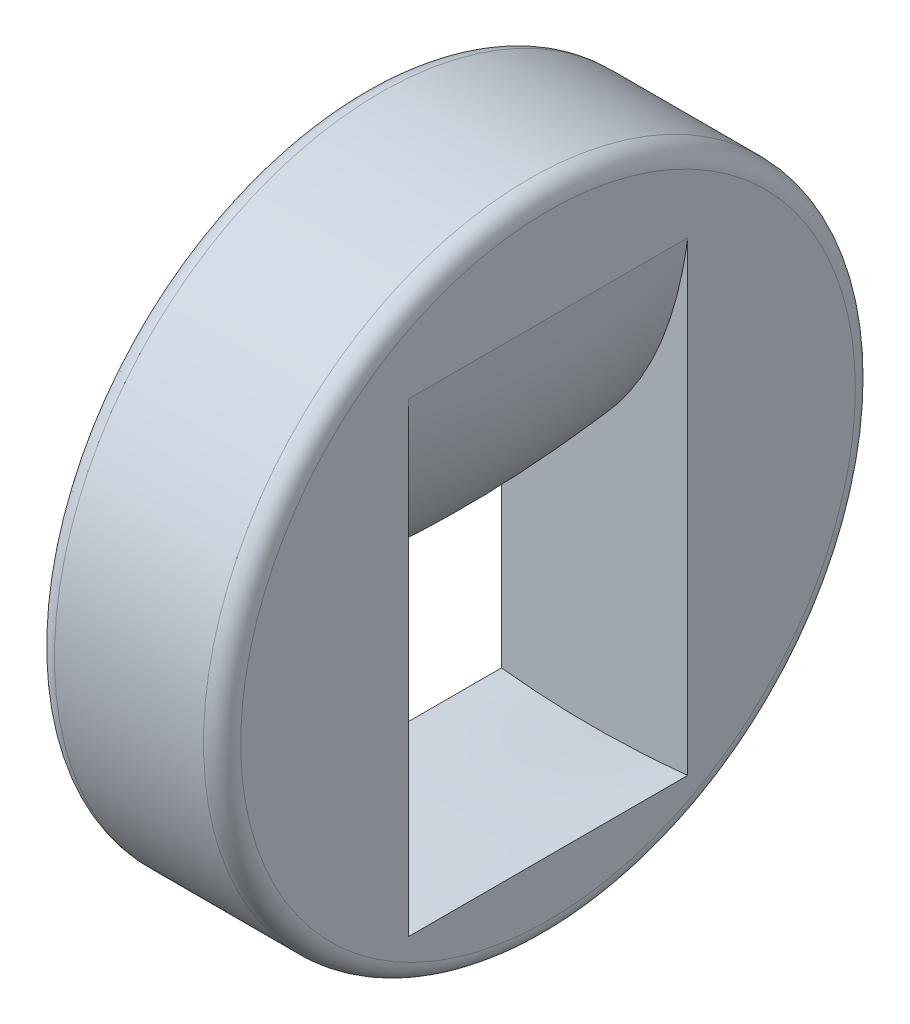
ISO-10303-21;
HEADER;
FILE_DESCRIPTION(('STEP AP214'),'2;1');
FILE_NAME('part.step','',(''),(''),'','','');
FILE_SCHEMA(('AUTOMOTIVE_DESIGN { 1 0 10303 214 1 1 1 1 }'));
ENDSEC;
DATA;
#1=APPLICATION_CONTEXT('core data for automotive mechanical design processes');
#2=APPLICATION_PROTOCOL_DEFINITION('international standard','automotive_design',2000,#1);
#3=PRODUCT_CONTEXT('',#1,'mechanical');
#4=PRODUCT('Part','Part','',(#3));
#5=PRODUCT_RELATED_PRODUCT_CATEGORY('part','',(#4));
#6=PRODUCT_DEFINITION_FORMATION('','',#4);
#7=PRODUCT_DEFINITION_CONTEXT('part definition',#1,'design');
#8=PRODUCT_DEFINITION('design','',#6,#7);
#9=PRODUCT_DEFINITION_SHAPE('','',#8);
#10=(LENGTH_UNIT() NAMED_UNIT(*) SI_UNIT(.MILLI.,.METRE.));
#11=(NAMED_UNIT(*) PLANE_ANGLE_UNIT() SI_UNIT($,.RADIAN.));
#12=(NAMED_UNIT(*) SI_UNIT($,.STERADIAN.) SOLID_ANGLE_UNIT());
#13=UNCERTAINTY_MEASURE_WITH_UNIT(LENGTH_MEASURE(1.E-05),#10,'distance_accuracy_value','');
#14=(GEOMETRIC_REPRESENTATION_CONTEXT(3) GLOBAL_UNCERTAINTY_ASSIGNED_CONTEXT((#13)) GLOBAL_UNIT_ASSIGNED_CONTEXT((#10,
#11,#12)) REPRESENTATION_CONTEXT('',''));
#15=CARTESIAN_POINT('',(0.,0.,0.));
#16=DIRECTION('',(0.,0.,1.));
#17=DIRECTION('',(1.,0.,0.));
#18=AXIS2_PLACEMENT_3D('',#15,#16,#17);
#19=CARTESIAN_POINT('',(-20.,0.,0.));
#20=DIRECTION('',(1.,0.,0.));
#21=DIRECTION('',(0.,0.,-1.));
#22=AXIS2_PLACEMENT_3D('',#19,#20,#21);
#23=PLANE('',#22);
#24=DIRECTION('',(0.,0.,1.));
#25=VECTOR('',#24,1.);
#26=CARTESIAN_POINT('',(-20.,-6.,-0.00311397094890572));
#27=LINE('',#26,#25);
#28=CARTESIAN_POINT('',(-20.,-6.,-15.));
#29=VERTEX_POINT('',#28);
#30=CARTESIAN_POINT('',(-20.,-5.99999999999999,15.));
#31=VERTEX_POINT('',#30);
#32=EDGE_CURVE('E483',#29,#31,#27,.T.);
#33=ORIENTED_EDGE('',*,*,#32,.T.);
#34=DIRECTION('',(0.,-1.,0.));
#35=VECTOR('',#34,1.);
#36=CARTESIAN_POINT('',(-20.,-16.5,15.));
#37=LINE('',#36,#35);
#38=CARTESIAN_POINT('',(-20.,-27.,15.));
#39=VERTEX_POINT('',#38);
#40=EDGE_CURVE('E477',#31,#39,#37,.T.);
#41=ORIENTED_EDGE('',*,*,#40,.T.);
#42=DIRECTION('',(0.,0.,-1.));
#43=VECTOR('',#42,1.);
#44=CARTESIAN_POINT('',(-20.,-27.,0.));
#45=LINE('',#44,#43);
#46=CARTESIAN_POINT('',(-20.,-27.,-15.));
#47=VERTEX_POINT('',#46);
#48=EDGE_CURVE('E464',#39,#47,#45,.T.);
#49=ORIENTED_EDGE('',*,*,#48,.T.);
#50=DIRECTION('',(0.,1.,0.));
#51=VECTOR('',#50,1.);
#52=CARTESIAN_POINT('',(-20.,-16.5,-15.));
#53=LINE('',#52,#51);
#54=EDGE_CURVE('E494',#47,#29,#53,.T.);
#55=ORIENTED_EDGE('',*,*,#54,.T.);
#56=EDGE_LOOP('',(#33,#41,#49,#55));
#57=FACE_BOUND('',#56,.T.);
#58=CARTESIAN_POINT('',(-20.,0.,0.));
#59=DIRECTION('',(1.,0.,0.));
#60=DIRECTION('',(0.,0.,-1.));
#61=AXIS2_PLACEMENT_3D('',#58,#59,#60);
#62=CIRCLE('',#61,33.);
#63=CARTESIAN_POINT('',(-20.,0.,-33.));
#64=VERTEX_POINT('',#63);
#65=EDGE_CURVE('E660',#64,#64,#62,.F.);
#66=ORIENTED_EDGE('',*,*,#65,.T.);
#67=EDGE_LOOP('',(#66));
#68=FACE_BOUND('',#67,.T.);
#69=DIRECTION('',(0.,0.,1.));
#70=VECTOR('',#69,1.);
#71=CARTESIAN_POINT('',(-20.,-1.,0.));
#72=LINE('',#71,#70);
#73=CARTESIAN_POINT('',(-20.,-1.,-5.));
#74=VERTEX_POINT('',#73);
#75=CARTESIAN_POINT('',(-20.,-1.,-2.25));
#76=VERTEX_POINT('',#75);
#77=EDGE_CURVE('E566',#74,#76,#72,.T.);
#78=ORIENTED_EDGE('',*,*,#77,.F.);
#79=DIRECTION('',(0.,-1.,0.));
#80=VECTOR('',#79,1.);
#81=CARTESIAN_POINT('',(-20.,0.,-5.));
#82=LINE('',#81,#80);
#83=CARTESIAN_POINT('',(-20.,1.25,-5.));
#84=VERTEX_POINT('',#83);
#85=EDGE_CURVE('E15',#84,#74,#82,.T.);
#86=ORIENTED_EDGE('',*,*,#85,.F.);
#87=DIRECTION('',(0.,0.,-1.));
#88=VECTOR('',#87,1.);
#89=CARTESIAN_POINT('',(-20.,1.25,0.));
#90=LINE('',#89,#88);
#91=CARTESIAN_POINT('',(-20.,1.25,-1.87082869338697));
#92=VERTEX_POINT('',#91);
#93=EDGE_CURVE('E603',#92,#84,#90,.T.);
#94=ORIENTED_EDGE('',*,*,#93,.F.);
#95=CARTESIAN_POINT('',(-20.,0.,0.));
#96=DIRECTION('',(1.,0.,0.));
#97=DIRECTION('',(0.,0.,-1.));
#98=AXIS2_PLACEMENT_3D('',#95,#96,#97);
#99=CIRCLE('',#98,2.25);
#100=CARTESIAN_POINT('',(-20.,2.01556443707464,-1.));
#101=VERTEX_POINT('',#100);
#102=EDGE_CURVE('E646',#92,#101,#99,.T.);
#103=ORIENTED_EDGE('',*,*,#102,.T.);
#104=DIRECTION('',(0.,-1.,0.));
#105=VECTOR('',#104,1.);
#106=CARTESIAN_POINT('',(-20.,0.,-1.));
#107=LINE('',#106,#105);
#108=CARTESIAN_POINT('',(-20.,4.99999999999999,-0.999999999999997));
#109=VERTEX_POINT('',#108);
#110=EDGE_CURVE('E598',#109,#101,#107,.T.);
#111=ORIENTED_EDGE('',*,*,#110,.F.);
#112=DIRECTION('',(0.,0.,-1.));
#113=VECTOR('',#112,1.);
#114=CARTESIAN_POINT('',(-20.,4.99999999999999,0.));
#115=LINE('',#114,#113);
#116=CARTESIAN_POINT('',(-20.,5.,1.25));
#117=VERTEX_POINT('',#116);
#118=EDGE_CURVE('E299',#117,#109,#115,.T.);
#119=ORIENTED_EDGE('',*,*,#118,.F.);
#120=DIRECTION('',(0.,1.,0.));
#121=VECTOR('',#120,1.);
#122=CARTESIAN_POINT('',(-20.,0.,1.25));
#123=LINE('',#122,#121);
#124=CARTESIAN_POINT('',(-20.,1.87082869338697,1.25));
#125=VERTEX_POINT('',#124);
#126=EDGE_CURVE('E593',#125,#117,#123,.T.);
#127=ORIENTED_EDGE('',*,*,#126,.F.);
#128=CARTESIAN_POINT('',(-20.,0.999999999999987,2.01556443707465));
#129=VERTEX_POINT('',#128);
#130=EDGE_CURVE('E643',#125,#129,#99,.T.);
#131=ORIENTED_EDGE('',*,*,#130,.T.);
#132=DIRECTION('',(0.,0.,-1.));
#133=VECTOR('',#132,1.);
#134=CARTESIAN_POINT('',(-20.,0.999999999999987,0.));
#135=LINE('',#134,#133);
#136=CARTESIAN_POINT('',(-20.,0.999999999999987,4.99999999999999));
#137=VERTEX_POINT('',#136);
#138=EDGE_CURVE('E587',#137,#129,#135,.T.);
#139=ORIENTED_EDGE('',*,*,#138,.F.);
#140=DIRECTION('',(0.,1.,0.));
#141=VECTOR('',#140,1.);
#142=CARTESIAN_POINT('',(-20.,0.,4.99999999999999));
#143=LINE('',#142,#141);
#144=CARTESIAN_POINT('',(-20.,-1.25000000000001,4.99999999999999));
#145=VERTEX_POINT('',#144);
#146=EDGE_CURVE('E669',#145,#137,#143,.T.);
#147=ORIENTED_EDGE('',*,*,#146,.F.);
#148=DIRECTION('',(0.,0.,1.));
#149=VECTOR('',#148,1.);
#150=CARTESIAN_POINT('',(-20.,-1.25,0.));
#151=LINE('',#150,#149);
#152=CARTESIAN_POINT('',(-20.,-1.25000000000001,2.25));
#153=VERTEX_POINT('',#152);
#154=EDGE_CURVE('E582',#153,#145,#151,.T.);
#155=ORIENTED_EDGE('',*,*,#154,.F.);
#156=DIRECTION('',(0.,-1.,0.));
#157=VECTOR('',#156,1.);
#158=CARTESIAN_POINT('',(-20.,0.,2.25));
#159=LINE('',#158,#157);
#160=CARTESIAN_POINT('',(-20.,-2.,2.25));
#161=VERTEX_POINT('',#160);
#162=EDGE_CURVE('E647',#153,#161,#159,.T.);
#163=ORIENTED_EDGE('',*,*,#162,.T.);
#164=DIRECTION('',(0.,0.,-1.));
#165=VECTOR('',#164,1.);
#166=CARTESIAN_POINT('',(-20.,-2.,1.25));
#167=LINE('',#166,#165);
#168=CARTESIAN_POINT('',(-20.,-2.,0.999999999999984));
#169=VERTEX_POINT('',#168);
#170=EDGE_CURVE('E637',#161,#169,#167,.T.);
#171=ORIENTED_EDGE('',*,*,#170,.T.);
#172=DIRECTION('',(0.,1.,0.));
#173=VECTOR('',#172,1.);
#174=CARTESIAN_POINT('',(-20.,0.,0.999999999999984));
#175=LINE('',#174,#173);
#176=CARTESIAN_POINT('',(-20.,-5.,0.999999999999984));
#177=VERTEX_POINT('',#176);
#178=EDGE_CURVE('E577',#177,#169,#175,.T.);
#179=ORIENTED_EDGE('',*,*,#178,.F.);
#180=DIRECTION('',(0.,0.,1.));
#181=VECTOR('',#180,1.);
#182=CARTESIAN_POINT('',(-20.,-5.,0.));
#183=LINE('',#182,#181);
#184=CARTESIAN_POINT('',(-20.,-5.,-1.25000000000002));
#185=VERTEX_POINT('',#184);
#186=EDGE_CURVE('E666',#185,#177,#183,.T.);
#187=ORIENTED_EDGE('',*,*,#186,.F.);
#188=DIRECTION('',(0.,-1.,0.));
#189=VECTOR('',#188,1.);
#190=CARTESIAN_POINT('',(-20.,0.,-1.25000000000002));
#191=LINE('',#190,#189);
#192=CARTESIAN_POINT('',(-20.,-2.,-1.25000000000002));
#193=VERTEX_POINT('',#192);
#194=EDGE_CURVE('E572',#193,#185,#191,.T.);
#195=ORIENTED_EDGE('',*,*,#194,.F.);
#196=CARTESIAN_POINT('',(-20.,-2.,-2.25));
#197=VERTEX_POINT('',#196);
#198=EDGE_CURVE('E620',#193,#197,#167,.T.);
#199=ORIENTED_EDGE('',*,*,#198,.T.);
#200=DIRECTION('',(0.,1.,0.));
#201=VECTOR('',#200,1.);
#202=CARTESIAN_POINT('',(-20.,-1.,-2.25));
#203=LINE('',#202,#201);
#204=EDGE_CURVE('E640',#197,#76,#203,.T.);
#205=ORIENTED_EDGE('',*,*,#204,.T.);
#206=EDGE_LOOP('',(#78,#86,#94,#103,#111,#119,#127,#131,#139,#147,#155,#163,#171,#179,#187,#195,
#199,#205));
#207=FACE_BOUND('',#206,.T.);
#208=ADVANCED_FACE('F291',(#57,#68,#207),#23,.F.);
#209=CARTESIAN_POINT('',(-24.,-2.,1.25));
#210=DIRECTION('',(0.,-1.,0.));
#211=DIRECTION('',(0.,0.,-1.));
#212=AXIS2_PLACEMENT_3D('',#209,#210,#211);
#213=PLANE('',#212);
#214=DIRECTION('',(0.,0.,-1.));
#215=VECTOR('',#214,1.);
#216=CARTESIAN_POINT('',(-24.,-2.,1.25));
#217=LINE('',#216,#215);
#218=CARTESIAN_POINT('',(-24.,-2.,2.25));
#219=VERTEX_POINT('',#218);
#220=CARTESIAN_POINT('',(-24.,-2.,0.999999999999984));
#221=VERTEX_POINT('',#220);
#222=EDGE_CURVE('E626',#219,#221,#217,.T.);
#223=ORIENTED_EDGE('',*,*,#222,.T.);
#224=DIRECTION('',(1.,0.,0.));
#225=VECTOR('',#224,1.);
#226=CARTESIAN_POINT('',(-24.,-2.,0.999999999999984));
#227=LINE('',#226,#225);
#228=EDGE_CURVE('E575',#221,#169,#227,.T.);
#229=ORIENTED_EDGE('',*,*,#228,.T.);
#230=ORIENTED_EDGE('',*,*,#170,.F.);
#231=DIRECTION('',(1.,0.,0.));
#232=VECTOR('',#231,1.);
#233=CARTESIAN_POINT('',(-24.,-2.,2.25));
#234=LINE('',#233,#232);
#235=EDGE_CURVE('E649',#219,#161,#234,.T.);
#236=ORIENTED_EDGE('',*,*,#235,.F.);
#237=EDGE_LOOP('',(#223,#229,#230,#236));
#238=FACE_BOUND('',#237,.T.);
#239=ADVANCED_FACE('F716',(#238),#213,.T.);
#240=ORIENTED_EDGE('',*,*,#198,.F.);
#241=DIRECTION('',(-1.,0.,0.));
#242=VECTOR('',#241,1.);
#243=CARTESIAN_POINT('',(-24.,-2.,-1.25000000000002));
#244=LINE('',#243,#242);
#245=CARTESIAN_POINT('',(-24.,-2.,-1.25000000000002));
#246=VERTEX_POINT('',#245);
#247=EDGE_CURVE('E569',#193,#246,#244,.T.);
#248=ORIENTED_EDGE('',*,*,#247,.T.);
#249=CARTESIAN_POINT('',(-24.,-2.,-2.25));
#250=VERTEX_POINT('',#249);
#251=EDGE_CURVE('E629',#246,#250,#217,.T.);
#252=ORIENTED_EDGE('',*,*,#251,.T.);
#253=DIRECTION('',(1.,0.,0.));
#254=VECTOR('',#253,1.);
#255=CARTESIAN_POINT('',(-24.,-2.,-2.25));
#256=LINE('',#255,#254);
#257=EDGE_CURVE('E636',#250,#197,#256,.T.);
#258=ORIENTED_EDGE('',*,*,#257,.T.);
#259=EDGE_LOOP('',(#240,#248,#252,#258));
#260=FACE_BOUND('',#259,.T.);
#261=ADVANCED_FACE('F733',(#260),#213,.T.);
#262=CARTESIAN_POINT('',(-24.,0.,2.25));
#263=DIRECTION('',(0.,0.,1.));
#264=DIRECTION('',(1.,0.,0.));
#265=AXIS2_PLACEMENT_3D('',#262,#263,#264);
#266=PLANE('',#265);
#267=ORIENTED_EDGE('',*,*,#162,.F.);
#268=DIRECTION('',(-1.,0.,0.));
#269=VECTOR('',#268,1.);
#270=CARTESIAN_POINT('',(-24.,-1.25000000000001,2.25));
#271=LINE('',#270,#269);
#272=CARTESIAN_POINT('',(-24.,-1.25000000000001,2.25));
#273=VERTEX_POINT('',#272);
#274=EDGE_CURVE('E580',#153,#273,#271,.T.);
#275=ORIENTED_EDGE('',*,*,#274,.T.);
#276=DIRECTION('',(0.,-1.,0.));
#277=VECTOR('',#276,1.);
#278=CARTESIAN_POINT('',(-24.,0.,2.25));
#279=LINE('',#278,#277);
#280=EDGE_CURVE('E634',#273,#219,#279,.T.);
#281=ORIENTED_EDGE('',*,*,#280,.T.);
#282=ORIENTED_EDGE('',*,*,#235,.T.);
#283=EDGE_LOOP('',(#267,#275,#281,#282));
#284=FACE_BOUND('',#283,.T.);
#285=ADVANCED_FACE('F709',(#284),#266,.T.);
#286=CARTESIAN_POINT('',(-24.,0.,0.));
#287=DIRECTION('',(1.,0.,0.));
#288=DIRECTION('',(0.,0.,-1.));
#289=AXIS2_PLACEMENT_3D('',#286,#287,#288);
#290=CYLINDRICAL_SURFACE('',#289,2.25);
#291=ORIENTED_EDGE('',*,*,#102,.F.);
#292=DIRECTION('',(1.,0.,0.));
#293=VECTOR('',#292,1.);
#294=CARTESIAN_POINT('',(-24.,1.25,-1.87082869338697));
#295=LINE('',#294,#293);
#296=CARTESIAN_POINT('',(-24.,1.25,-1.87082869338697));
#297=VERTEX_POINT('',#296);
#298=EDGE_CURVE('E601',#92,#297,#295,.F.);
#299=ORIENTED_EDGE('',*,*,#298,.T.);
#300=CARTESIAN_POINT('',(-24.,0.,0.));
#301=DIRECTION('',(1.,0.,0.));
#302=DIRECTION('',(0.,0.,-1.));
#303=AXIS2_PLACEMENT_3D('',#300,#301,#302);
#304=CIRCLE('',#303,2.25);
#305=CARTESIAN_POINT('',(-24.,2.01556443707464,-1.));
#306=VERTEX_POINT('',#305);
#307=EDGE_CURVE('E633',#297,#306,#304,.T.);
#308=ORIENTED_EDGE('',*,*,#307,.T.);
#309=DIRECTION('',(1.,0.,0.));
#310=VECTOR('',#309,1.);
#311=CARTESIAN_POINT('',(-24.,2.01556443707464,-1.));
#312=LINE('',#311,#310);
#313=EDGE_CURVE('E596',#306,#101,#312,.T.);
#314=ORIENTED_EDGE('',*,*,#313,.T.);
#315=EDGE_LOOP('',(#291,#299,#308,#314));
#316=FACE_BOUND('',#315,.T.);
#317=ADVANCED_FACE('F751',(#316),#290,.T.);
#318=ORIENTED_EDGE('',*,*,#130,.F.);
#319=DIRECTION('',(1.,0.,0.));
#320=VECTOR('',#319,1.);
#321=CARTESIAN_POINT('',(-24.,1.87082869338697,1.25));
#322=LINE('',#321,#320);
#323=CARTESIAN_POINT('',(-24.,1.87082869338697,1.25));
#324=VERTEX_POINT('',#323);
#325=EDGE_CURVE('E590',#125,#324,#322,.F.);
#326=ORIENTED_EDGE('',*,*,#325,.T.);
#327=CARTESIAN_POINT('',(-24.,0.999999999999987,2.01556443707464));
#328=VERTEX_POINT('',#327);
#329=EDGE_CURVE('E631',#324,#328,#304,.T.);
#330=ORIENTED_EDGE('',*,*,#329,.T.);
#331=DIRECTION('',(1.,0.,0.));
#332=VECTOR('',#331,1.);
#333=CARTESIAN_POINT('',(-24.,0.999999999999987,2.01556443707464));
#334=LINE('',#333,#332);
#335=EDGE_CURVE('E585',#328,#129,#334,.T.);
#336=ORIENTED_EDGE('',*,*,#335,.T.);
#337=EDGE_LOOP('',(#318,#326,#330,#336));
#338=FACE_BOUND('',#337,.T.);
#339=ADVANCED_FACE('F694',(#338),#290,.T.);
#340=CARTESIAN_POINT('',(-24.,-1.,-2.25));
#341=DIRECTION('',(0.,0.,-1.));
#342=DIRECTION('',(-1.,0.,0.));
#343=AXIS2_PLACEMENT_3D('',#340,#341,#342);
#344=PLANE('',#343);
#345=DIRECTION('',(0.,1.,0.));
#346=VECTOR('',#345,1.);
#347=CARTESIAN_POINT('',(-24.,-1.,-2.25));
#348=LINE('',#347,#346);
#349=CARTESIAN_POINT('',(-24.,-1.,-2.25));
#350=VERTEX_POINT('',#349);
#351=EDGE_CURVE('E628',#250,#350,#348,.T.);
#352=ORIENTED_EDGE('',*,*,#351,.T.);
#353=DIRECTION('',(1.,0.,0.));
#354=VECTOR('',#353,1.);
#355=CARTESIAN_POINT('',(-24.,-1.,-2.25));
#356=LINE('',#355,#354);
#357=EDGE_CURVE('E551',#350,#76,#356,.T.);
#358=ORIENTED_EDGE('',*,*,#357,.T.);
#359=ORIENTED_EDGE('',*,*,#204,.F.);
#360=ORIENTED_EDGE('',*,*,#257,.F.);
#361=EDGE_LOOP('',(#352,#358,#359,#360));
#362=FACE_BOUND('',#361,.T.);
#363=ADVANCED_FACE('F758',(#362),#344,.T.);
#364=CARTESIAN_POINT('',(-20.,0.,0.));
#365=DIRECTION('',(1.,0.,0.));
#366=DIRECTION('',(0.,0.,-1.));
#367=AXIS2_PLACEMENT_3D('',#364,#365,#366);
#368=CYLINDRICAL_SURFACE('',#367,35.);
#369=CARTESIAN_POINT('',(-18.,0.,0.));
#370=DIRECTION('',(1.,0.,0.));
#371=DIRECTION('',(0.,0.,-1.));
#372=AXIS2_PLACEMENT_3D('',#369,#370,#371);
#373=CIRCLE('',#372,35.);
#374=CARTESIAN_POINT('',(-18.,0.,-35.));
#375=VERTEX_POINT('',#374);
#376=EDGE_CURVE('E657',#375,#375,#373,.T.);
#377=ORIENTED_EDGE('',*,*,#376,.T.);
#378=EDGE_LOOP('',(#377));
#379=FACE_BOUND('',#378,.T.);
#380=CARTESIAN_POINT('',(-2.,0.,0.));
#381=DIRECTION('',(1.,0.,0.));
#382=DIRECTION('',(0.,0.,-1.));
#383=AXIS2_PLACEMENT_3D('',#380,#381,#382);
#384=CIRCLE('',#383,35.);
#385=CARTESIAN_POINT('',(-2.,0.,-35.));
#386=VERTEX_POINT('',#385);
#387=EDGE_CURVE('E652',#386,#386,#384,.F.);
#388=ORIENTED_EDGE('',*,*,#387,.T.);
#389=EDGE_LOOP('',(#388));
#390=FACE_BOUND('',#389,.T.);
#391=ADVANCED_FACE('F772',(#379,#390),#368,.T.);
#392=CARTESIAN_POINT('',(0.,0.,0.));
#393=DIRECTION('',(1.,0.,0.));
#394=DIRECTION('',(0.,0.,-1.));
#395=AXIS2_PLACEMENT_3D('',#392,#393,#394);
#396=PLANE('',#395);
#397=DIRECTION('',(0.,-1.,0.));
#398=VECTOR('',#397,1.);
#399=CARTESIAN_POINT('',(0.,-2.,15.));
#400=LINE('',#399,#398);
#401=CARTESIAN_POINT('',(0.,23.,15.));
#402=VERTEX_POINT('',#401);
#403=CARTESIAN_POINT('',(0.,-27.,15.));
#404=VERTEX_POINT('',#403);
#405=EDGE_CURVE('E480',#402,#404,#400,.T.);
#406=ORIENTED_EDGE('',*,*,#405,.F.);
#407=DIRECTION('',(0.,0.,1.));
#408=VECTOR('',#407,1.);
#409=CARTESIAN_POINT('',(0.,23.,-0.00311396848837413));
#410=LINE('',#409,#408);
#411=CARTESIAN_POINT('',(0.,23.,-15.));
#412=VERTEX_POINT('',#411);
#413=EDGE_CURVE('E502',#412,#402,#410,.T.);
#414=ORIENTED_EDGE('',*,*,#413,.F.);
#415=DIRECTION('',(0.,1.,0.));
#416=VECTOR('',#415,1.);
#417=CARTESIAN_POINT('',(0.,-2.,-15.));
#418=LINE('',#417,#416);
#419=CARTESIAN_POINT('',(0.,-27.,-15.));
#420=VERTEX_POINT('',#419);
#421=EDGE_CURVE('E500',#420,#412,#418,.T.);
#422=ORIENTED_EDGE('',*,*,#421,.F.);
#423=DIRECTION('',(0.,0.,-1.));
#424=VECTOR('',#423,1.);
#425=CARTESIAN_POINT('',(0.,-27.,0.));
#426=LINE('',#425,#424);
#427=EDGE_CURVE('E498',#404,#420,#426,.T.);
#428=ORIENTED_EDGE('',*,*,#427,.F.);
#429=EDGE_LOOP('',(#406,#414,#422,#428));
#430=FACE_BOUND('',#429,.T.);
#431=CARTESIAN_POINT('',(0.,0.,0.));
#432=DIRECTION('',(1.,0.,0.));
#433=DIRECTION('',(0.,0.,-1.));
#434=AXIS2_PLACEMENT_3D('',#431,#432,#433);
#435=CIRCLE('',#434,33.);
#436=CARTESIAN_POINT('',(0.,0.,-33.));
#437=VERTEX_POINT('',#436);
#438=EDGE_CURVE('E663',#437,#437,#435,.T.);
#439=ORIENTED_EDGE('',*,*,#438,.T.);
#440=EDGE_LOOP('',(#439));
#441=FACE_BOUND('',#440,.T.);
#442=ADVANCED_FACE('F768',(#430,#441),#396,.T.);
#443=CARTESIAN_POINT('',(-18.,0.,0.));
#444=DIRECTION('',(1.,0.,0.));
#445=DIRECTION('',(0.,0.,-1.));
#446=AXIS2_PLACEMENT_3D('',#443,#444,#445);
#447=TOROIDAL_SURFACE('',#446,33.,2.);
#448=ORIENTED_EDGE('',*,*,#65,.F.);
#449=EDGE_LOOP('',(#448));
#450=FACE_BOUND('',#449,.T.);
#451=ORIENTED_EDGE('',*,*,#376,.F.);
#452=EDGE_LOOP('',(#451));
#453=FACE_BOUND('',#452,.T.);
#454=ADVANCED_FACE('F771',(#450,#453),#447,.T.);
#455=CARTESIAN_POINT('',(-2.,0.,0.));
#456=DIRECTION('',(1.,0.,0.));
#457=DIRECTION('',(0.,0.,-1.));
#458=AXIS2_PLACEMENT_3D('',#455,#456,#457);
#459=TOROIDAL_SURFACE('',#458,33.,2.);
#460=ORIENTED_EDGE('',*,*,#387,.F.);
#461=EDGE_LOOP('',(#460));
#462=FACE_BOUND('',#461,.T.);
#463=ORIENTED_EDGE('',*,*,#438,.F.);
#464=EDGE_LOOP('',(#463));
#465=FACE_BOUND('',#464,.T.);
#466=ADVANCED_FACE('F293',(#462,#465),#459,.T.);
#467=CARTESIAN_POINT('',(-24.,0.,0.));
#468=DIRECTION('',(1.,0.,0.));
#469=DIRECTION('',(0.,0.,-1.));
#470=AXIS2_PLACEMENT_3D('',#467,#468,#469);
#471=PLANE('',#470);
#472=ORIENTED_EDGE('',*,*,#280,.F.);
#473=DIRECTION('',(0.,0.,-1.));
#474=VECTOR('',#473,1.);
#475=CARTESIAN_POINT('',(-24.,-1.25,0.));
#476=LINE('',#475,#474);
#477=CARTESIAN_POINT('',(-24.,-1.25000000000001,4.99999999999999));
#478=VERTEX_POINT('',#477);
#479=EDGE_CURVE('E521',#478,#273,#476,.T.);
#480=ORIENTED_EDGE('',*,*,#479,.F.);
#481=DIRECTION('',(0.,-1.,0.));
#482=VECTOR('',#481,1.);
#483=CARTESIAN_POINT('',(-24.,0.,4.99999999999999));
#484=LINE('',#483,#482);
#485=CARTESIAN_POINT('',(-24.,0.999999999999987,4.99999999999999));
#486=VERTEX_POINT('',#485);
#487=EDGE_CURVE('E524',#486,#478,#484,.T.);
#488=ORIENTED_EDGE('',*,*,#487,.F.);
#489=DIRECTION('',(0.,0.,1.));
#490=VECTOR('',#489,1.);
#491=CARTESIAN_POINT('',(-24.,0.999999999999987,0.));
#492=LINE('',#491,#490);
#493=EDGE_CURVE('E527',#328,#486,#492,.T.);
#494=ORIENTED_EDGE('',*,*,#493,.F.);
#495=ORIENTED_EDGE('',*,*,#329,.F.);
#496=DIRECTION('',(0.,-1.,0.));
#497=VECTOR('',#496,1.);
#498=CARTESIAN_POINT('',(-24.,0.,1.25));
#499=LINE('',#498,#497);
#500=CARTESIAN_POINT('',(-24.,5.,1.25));
#501=VERTEX_POINT('',#500);
#502=EDGE_CURVE('E530',#501,#324,#499,.T.);
#503=ORIENTED_EDGE('',*,*,#502,.F.);
#504=DIRECTION('',(0.,0.,1.));
#505=VECTOR('',#504,1.);
#506=CARTESIAN_POINT('',(-24.,4.99999999999999,0.));
#507=LINE('',#506,#505);
#508=CARTESIAN_POINT('',(-24.,4.99999999999999,-0.999999999999997));
#509=VERTEX_POINT('',#508);
#510=EDGE_CURVE('E533',#509,#501,#507,.T.);
#511=ORIENTED_EDGE('',*,*,#510,.F.);
#512=DIRECTION('',(0.,1.,0.));
#513=VECTOR('',#512,1.);
#514=CARTESIAN_POINT('',(-24.,0.,-1.));
#515=LINE('',#514,#513);
#516=EDGE_CURVE('E536',#306,#509,#515,.T.);
#517=ORIENTED_EDGE('',*,*,#516,.F.);
#518=ORIENTED_EDGE('',*,*,#307,.F.);
#519=DIRECTION('',(0.,0.,1.));
#520=VECTOR('',#519,1.);
#521=CARTESIAN_POINT('',(-24.,1.25,0.));
#522=LINE('',#521,#520);
#523=CARTESIAN_POINT('',(-24.,1.25,-5.));
#524=VERTEX_POINT('',#523);
#525=EDGE_CURVE('E539',#524,#297,#522,.T.);
#526=ORIENTED_EDGE('',*,*,#525,.F.);
#527=DIRECTION('',(0.,1.,0.));
#528=VECTOR('',#527,1.);
#529=CARTESIAN_POINT('',(-24.,0.,-5.));
#530=LINE('',#529,#528);
#531=CARTESIAN_POINT('',(-24.,-1.,-5.));
#532=VERTEX_POINT('',#531);
#533=EDGE_CURVE('E542',#532,#524,#530,.T.);
#534=ORIENTED_EDGE('',*,*,#533,.F.);
#535=DIRECTION('',(0.,0.,-1.));
#536=VECTOR('',#535,1.);
#537=CARTESIAN_POINT('',(-24.,-1.,0.));
#538=LINE('',#537,#536);
#539=EDGE_CURVE('E545',#350,#532,#538,.T.);
#540=ORIENTED_EDGE('',*,*,#539,.F.);
#541=ORIENTED_EDGE('',*,*,#351,.F.);
#542=ORIENTED_EDGE('',*,*,#251,.F.);
#543=DIRECTION('',(0.,1.,0.));
#544=VECTOR('',#543,1.);
#545=CARTESIAN_POINT('',(-24.,0.,-1.25000000000002));
#546=LINE('',#545,#544);
#547=CARTESIAN_POINT('',(-24.,-5.,-1.25000000000002));
#548=VERTEX_POINT('',#547);
#549=EDGE_CURVE('E512',#548,#246,#546,.T.);
#550=ORIENTED_EDGE('',*,*,#549,.F.);
#551=DIRECTION('',(0.,0.,-1.));
#552=VECTOR('',#551,1.);
#553=CARTESIAN_POINT('',(-24.,-5.,0.));
#554=LINE('',#553,#552);
#555=CARTESIAN_POINT('',(-24.,-5.,0.999999999999984));
#556=VERTEX_POINT('',#555);
#557=EDGE_CURVE('E515',#556,#548,#554,.T.);
#558=ORIENTED_EDGE('',*,*,#557,.F.);
#559=DIRECTION('',(0.,-1.,0.));
#560=VECTOR('',#559,1.);
#561=CARTESIAN_POINT('',(-24.,0.,0.999999999999984));
#562=LINE('',#561,#560);
#563=EDGE_CURVE('E518',#221,#556,#562,.T.);
#564=ORIENTED_EDGE('',*,*,#563,.F.);
#565=ORIENTED_EDGE('',*,*,#222,.F.);
#566=EDGE_LOOP('',(#472,#480,#488,#494,#495,#503,#511,#517,#518,#526,#534,#540,#541,#542,#550,
#558,#564,#565));
#567=FACE_BOUND('',#566,.T.);
#568=DIRECTION('',(0.,0.,-1.));
#569=VECTOR('',#568,1.);
#570=CARTESIAN_POINT('',(-24.,-1.,1.25));
#571=LINE('',#570,#569);
#572=CARTESIAN_POINT('',(-24.,-1.,1.25));
#573=VERTEX_POINT('',#572);
#574=CARTESIAN_POINT('',(-24.,-1.,-1.25));
#575=VERTEX_POINT('',#574);
#576=EDGE_CURVE('E606',#573,#575,#571,.T.);
#577=ORIENTED_EDGE('',*,*,#576,.T.);
#578=DIRECTION('',(0.,1.,0.));
#579=VECTOR('',#578,1.);
#580=CARTESIAN_POINT('',(-24.,-1.,-1.25));
#581=LINE('',#580,#579);
#582=CARTESIAN_POINT('',(-24.,0.,-1.25));
#583=VERTEX_POINT('',#582);
#584=EDGE_CURVE('E608',#575,#583,#581,.T.);
#585=ORIENTED_EDGE('',*,*,#584,.T.);
#586=CARTESIAN_POINT('',(-24.,0.,0.));
#587=DIRECTION('',(1.,0.,0.));
#588=DIRECTION('',(0.,0.,-1.));
#589=AXIS2_PLACEMENT_3D('',#586,#587,#588);
#590=CIRCLE('',#589,1.25);
#591=CARTESIAN_POINT('',(-24.,0.,1.25));
#592=VERTEX_POINT('',#591);
#593=EDGE_CURVE('E611',#583,#592,#590,.T.);
#594=ORIENTED_EDGE('',*,*,#593,.T.);
#595=DIRECTION('',(0.,-1.,0.));
#596=VECTOR('',#595,1.);
#597=CARTESIAN_POINT('',(-24.,0.,1.25));
#598=LINE('',#597,#596);
#599=EDGE_CURVE('E614',#592,#573,#598,.T.);
#600=ORIENTED_EDGE('',*,*,#599,.T.);
#601=EDGE_LOOP('',(#577,#585,#594,#600));
#602=FACE_BOUND('',#601,.T.);
#603=ADVANCED_FACE('F686',(#567,#602),#471,.F.);
#604=CARTESIAN_POINT('',(-24.,-1.,1.25));
#605=DIRECTION('',(0.,-1.,0.));
#606=DIRECTION('',(0.,0.,-1.));
#607=AXIS2_PLACEMENT_3D('',#604,#605,#606);
#608=PLANE('',#607);
#609=DIRECTION('',(1.,0.,0.));
#610=VECTOR('',#609,1.);
#611=CARTESIAN_POINT('',(-24.,-1.,1.25));
#612=LINE('',#611,#610);
#613=CARTESIAN_POINT('',(-14.,-1.,1.25));
#614=VERTEX_POINT('',#613);
#615=EDGE_CURVE('E618',#573,#614,#612,.T.);
#616=ORIENTED_EDGE('',*,*,#615,.T.);
#617=DIRECTION('',(0.,0.,-1.));
#618=VECTOR('',#617,1.);
#619=CARTESIAN_POINT('',(-14.,-1.,0.));
#620=LINE('',#619,#618);
#621=CARTESIAN_POINT('',(-14.,-1.,-1.25));
#622=VERTEX_POINT('',#621);
#623=EDGE_CURVE('E506',#614,#622,#620,.T.);
#624=ORIENTED_EDGE('',*,*,#623,.T.);
#625=DIRECTION('',(1.,0.,0.));
#626=VECTOR('',#625,1.);
#627=CARTESIAN_POINT('',(-24.,-1.,-1.25));
#628=LINE('',#627,#626);
#629=EDGE_CURVE('E617',#575,#622,#628,.T.);
#630=ORIENTED_EDGE('',*,*,#629,.F.);
#631=ORIENTED_EDGE('',*,*,#576,.F.);
#632=EDGE_LOOP('',(#616,#624,#630,#631));
#633=FACE_BOUND('',#632,.T.);
#634=ADVANCED_FACE('F793',(#633),#608,.F.);
#635=CARTESIAN_POINT('',(-24.,0.,1.25));
#636=DIRECTION('',(0.,0.,1.));
#637=DIRECTION('',(1.,0.,0.));
#638=AXIS2_PLACEMENT_3D('',#635,#636,#637);
#639=PLANE('',#638);
#640=DIRECTION('',(1.,0.,0.));
#641=VECTOR('',#640,1.);
#642=CARTESIAN_POINT('',(-24.,0.,1.25));
#643=LINE('',#642,#641);
#644=CARTESIAN_POINT('',(-14.,0.,1.25));
#645=VERTEX_POINT('',#644);
#646=EDGE_CURVE('E621',#592,#645,#643,.T.);
#647=ORIENTED_EDGE('',*,*,#646,.T.);
#648=DIRECTION('',(0.,-1.,0.));
#649=VECTOR('',#648,1.);
#650=CARTESIAN_POINT('',(-14.,0.,1.25));
#651=LINE('',#650,#649);
#652=EDGE_CURVE('E509',#645,#614,#651,.T.);
#653=ORIENTED_EDGE('',*,*,#652,.T.);
#654=ORIENTED_EDGE('',*,*,#615,.F.);
#655=ORIENTED_EDGE('',*,*,#599,.F.);
#656=EDGE_LOOP('',(#647,#653,#654,#655));
#657=FACE_BOUND('',#656,.T.);
#658=ADVANCED_FACE('F798',(#657),#639,.F.);
#659=CARTESIAN_POINT('',(-24.,0.,0.));
#660=DIRECTION('',(1.,0.,0.));
#661=DIRECTION('',(0.,0.,-1.));
#662=AXIS2_PLACEMENT_3D('',#659,#660,#661);
#663=CYLINDRICAL_SURFACE('',#662,1.25);
#664=DIRECTION('',(1.,0.,0.));
#665=VECTOR('',#664,1.);
#666=CARTESIAN_POINT('',(-24.,0.,-1.25));
#667=LINE('',#666,#665);
#668=CARTESIAN_POINT('',(-14.,0.,-1.25));
#669=VERTEX_POINT('',#668);
#670=EDGE_CURVE('E623',#583,#669,#667,.T.);
#671=ORIENTED_EDGE('',*,*,#670,.T.);
#672=CARTESIAN_POINT('',(-14.,0.,0.));
#673=DIRECTION('',(-1.,0.,0.));
#674=DIRECTION('',(0.,0.,1.));
#675=AXIS2_PLACEMENT_3D('',#672,#673,#674);
#676=CIRCLE('',#675,1.25);
#677=EDGE_CURVE('E484',#669,#645,#676,.F.);
#678=ORIENTED_EDGE('',*,*,#677,.T.);
#679=ORIENTED_EDGE('',*,*,#646,.F.);
#680=ORIENTED_EDGE('',*,*,#593,.F.);
#681=EDGE_LOOP('',(#671,#678,#679,#680));
#682=FACE_BOUND('',#681,.T.);
#683=ADVANCED_FACE('F805',(#682),#663,.F.);
#684=CARTESIAN_POINT('',(-24.,-1.,-1.25));
#685=DIRECTION('',(0.,0.,-1.));
#686=DIRECTION('',(-1.,0.,0.));
#687=AXIS2_PLACEMENT_3D('',#684,#685,#686);
#688=PLANE('',#687);
#689=ORIENTED_EDGE('',*,*,#629,.T.);
#690=DIRECTION('',(0.,1.,0.));
#691=VECTOR('',#690,1.);
#692=CARTESIAN_POINT('',(-14.,0.,-1.25));
#693=LINE('',#692,#691);
#694=EDGE_CURVE('E487',#622,#669,#693,.T.);
#695=ORIENTED_EDGE('',*,*,#694,.T.);
#696=ORIENTED_EDGE('',*,*,#670,.F.);
#697=ORIENTED_EDGE('',*,*,#584,.F.);
#698=EDGE_LOOP('',(#689,#695,#696,#697));
#699=FACE_BOUND('',#698,.T.);
#700=ADVANCED_FACE('F802',(#699),#688,.F.);
#701=CARTESIAN_POINT('',(-14.,-1.,0.));
#702=DIRECTION('',(0.,1.,0.));
#703=DIRECTION('',(0.,0.,1.));
#704=AXIS2_PLACEMENT_3D('',#701,#702,#703);
#705=PLANE('',#704);
#706=DIRECTION('',(-1.,0.,0.));
#707=VECTOR('',#706,1.);
#708=CARTESIAN_POINT('',(-14.,-1.,-5.));
#709=LINE('',#708,#707);
#710=EDGE_CURVE('E549',#74,#532,#709,.T.);
#711=ORIENTED_EDGE('',*,*,#710,.F.);
#712=ORIENTED_EDGE('',*,*,#77,.T.);
#713=ORIENTED_EDGE('',*,*,#357,.F.);
#714=ORIENTED_EDGE('',*,*,#539,.T.);
#715=EDGE_LOOP('',(#711,#712,#713,#714));
#716=FACE_BOUND('',#715,.T.);
#717=ADVANCED_FACE('F739',(#716),#705,.F.);
#718=CARTESIAN_POINT('',(-14.,1.25,0.));
#719=DIRECTION('',(0.,-1.,0.));
#720=DIRECTION('',(0.,0.,-1.));
#721=AXIS2_PLACEMENT_3D('',#718,#719,#720);
#722=PLANE('',#721);
#723=ORIENTED_EDGE('',*,*,#298,.F.);
#724=ORIENTED_EDGE('',*,*,#93,.T.);
#725=DIRECTION('',(-1.,0.,0.));
#726=VECTOR('',#725,1.);
#727=CARTESIAN_POINT('',(-14.,1.25,-5.));
#728=LINE('',#727,#726);
#729=EDGE_CURVE('E552',#84,#524,#728,.T.);
#730=ORIENTED_EDGE('',*,*,#729,.T.);
#731=ORIENTED_EDGE('',*,*,#525,.T.);
#732=EDGE_LOOP('',(#723,#724,#730,#731));
#733=FACE_BOUND('',#732,.T.);
#734=ADVANCED_FACE('F748',(#733),#722,.F.);
#735=CARTESIAN_POINT('',(-14.,0.,-5.));
#736=DIRECTION('',(0.,0.,1.));
#737=DIRECTION('',(1.,0.,0.));
#738=AXIS2_PLACEMENT_3D('',#735,#736,#737);
#739=PLANE('',#738);
#740=ORIENTED_EDGE('',*,*,#729,.F.);
#741=ORIENTED_EDGE('',*,*,#85,.T.);
#742=ORIENTED_EDGE('',*,*,#710,.T.);
#743=ORIENTED_EDGE('',*,*,#533,.T.);
#744=EDGE_LOOP('',(#740,#741,#742,#743));
#745=FACE_BOUND('',#744,.T.);
#746=ADVANCED_FACE('F743',(#745),#739,.F.);
#747=CARTESIAN_POINT('',(-14.,0.999999999999987,0.));
#748=DIRECTION('',(0.,-1.,0.));
#749=DIRECTION('',(0.,0.,-1.));
#750=AXIS2_PLACEMENT_3D('',#747,#748,#749);
#751=PLANE('',#750);
#752=DIRECTION('',(-1.,0.,0.));
#753=VECTOR('',#752,1.);
#754=CARTESIAN_POINT('',(-14.,0.999999999999987,4.99999999999999));
#755=LINE('',#754,#753);
#756=EDGE_CURVE('E558',#137,#486,#755,.T.);
#757=ORIENTED_EDGE('',*,*,#756,.F.);
#758=ORIENTED_EDGE('',*,*,#138,.T.);
#759=ORIENTED_EDGE('',*,*,#335,.F.);
#760=ORIENTED_EDGE('',*,*,#493,.T.);
#761=EDGE_LOOP('',(#757,#758,#759,#760));
#762=FACE_BOUND('',#761,.T.);
#763=ADVANCED_FACE('F698',(#762),#751,.F.);
#764=CARTESIAN_POINT('',(-14.,-1.25,0.));
#765=DIRECTION('',(0.,1.,0.));
#766=DIRECTION('',(0.,0.,1.));
#767=AXIS2_PLACEMENT_3D('',#764,#765,#766);
#768=PLANE('',#767);
#769=ORIENTED_EDGE('',*,*,#274,.F.);
#770=ORIENTED_EDGE('',*,*,#154,.T.);
#771=DIRECTION('',(-1.,0.,0.));
#772=VECTOR('',#771,1.);
#773=CARTESIAN_POINT('',(-14.,-1.25000000000001,4.99999999999999));
#774=LINE('',#773,#772);
#775=EDGE_CURVE('E560',#145,#478,#774,.T.);
#776=ORIENTED_EDGE('',*,*,#775,.T.);
#777=ORIENTED_EDGE('',*,*,#479,.T.);
#778=EDGE_LOOP('',(#769,#770,#776,#777));
#779=FACE_BOUND('',#778,.T.);
#780=ADVANCED_FACE('F707',(#779),#768,.F.);
#781=CARTESIAN_POINT('',(-14.,0.,4.99999999999999));
#782=DIRECTION('',(0.,0.,-1.));
#783=DIRECTION('',(-1.,0.,0.));
#784=AXIS2_PLACEMENT_3D('',#781,#782,#783);
#785=PLANE('',#784);
#786=ORIENTED_EDGE('',*,*,#775,.F.);
#787=ORIENTED_EDGE('',*,*,#146,.T.);
#788=ORIENTED_EDGE('',*,*,#756,.T.);
#789=ORIENTED_EDGE('',*,*,#487,.T.);
#790=EDGE_LOOP('',(#786,#787,#788,#789));
#791=FACE_BOUND('',#790,.T.);
#792=ADVANCED_FACE('F703',(#791),#785,.F.);
#793=CARTESIAN_POINT('',(-14.,0.,1.25));
#794=DIRECTION('',(0.,0.,-1.));
#795=DIRECTION('',(-1.,0.,0.));
#796=AXIS2_PLACEMENT_3D('',#793,#794,#795);
#797=PLANE('',#796);
#798=ORIENTED_EDGE('',*,*,#325,.F.);
#799=ORIENTED_EDGE('',*,*,#126,.T.);
#800=DIRECTION('',(-1.,0.,0.));
#801=VECTOR('',#800,1.);
#802=CARTESIAN_POINT('',(-14.,5.,1.25));
#803=LINE('',#802,#801);
#804=EDGE_CURVE('E556',#117,#501,#803,.T.);
#805=ORIENTED_EDGE('',*,*,#804,.T.);
#806=ORIENTED_EDGE('',*,*,#502,.T.);
#807=EDGE_LOOP('',(#798,#799,#805,#806));
#808=FACE_BOUND('',#807,.T.);
#809=ADVANCED_FACE('F691',(#808),#797,.F.);
#810=CARTESIAN_POINT('',(-14.,0.,-1.));
#811=DIRECTION('',(0.,0.,1.));
#812=DIRECTION('',(0.,-1.,0.));
#813=AXIS2_PLACEMENT_3D('',#810,#811,#812);
#814=PLANE('',#813);
#815=DIRECTION('',(-1.,0.,0.));
#816=VECTOR('',#815,1.);
#817=CARTESIAN_POINT('',(-14.,4.99999999999999,-0.999999999999997));
#818=LINE('',#817,#816);
#819=EDGE_CURVE('E554',#109,#509,#818,.T.);
#820=ORIENTED_EDGE('',*,*,#819,.F.);
#821=ORIENTED_EDGE('',*,*,#110,.T.);
#822=ORIENTED_EDGE('',*,*,#313,.F.);
#823=ORIENTED_EDGE('',*,*,#516,.T.);
#824=EDGE_LOOP('',(#820,#821,#822,#823));
#825=FACE_BOUND('',#824,.T.);
#826=ADVANCED_FACE('F678',(#825),#814,.F.);
#827=CARTESIAN_POINT('',(-14.,4.99999999999999,0.));
#828=DIRECTION('',(0.,-1.,0.));
#829=DIRECTION('',(0.,0.,-1.));
#830=AXIS2_PLACEMENT_3D('',#827,#828,#829);
#831=PLANE('',#830);
#832=ORIENTED_EDGE('',*,*,#804,.F.);
#833=ORIENTED_EDGE('',*,*,#118,.T.);
#834=ORIENTED_EDGE('',*,*,#819,.T.);
#835=ORIENTED_EDGE('',*,*,#510,.T.);
#836=EDGE_LOOP('',(#832,#833,#834,#835));
#837=FACE_BOUND('',#836,.T.);
#838=ADVANCED_FACE('F675',(#837),#831,.F.);
#839=CARTESIAN_POINT('',(-14.,-5.,0.));
#840=DIRECTION('',(0.,1.,0.));
#841=DIRECTION('',(0.,0.,1.));
#842=AXIS2_PLACEMENT_3D('',#839,#840,#841);
#843=PLANE('',#842);
#844=DIRECTION('',(-1.,0.,0.));
#845=VECTOR('',#844,1.);
#846=CARTESIAN_POINT('',(-14.,-5.,-1.25000000000002));
#847=LINE('',#846,#845);
#848=EDGE_CURVE('E548',#185,#548,#847,.T.);
#849=ORIENTED_EDGE('',*,*,#848,.F.);
#850=ORIENTED_EDGE('',*,*,#186,.T.);
#851=DIRECTION('',(-1.,0.,0.));
#852=VECTOR('',#851,1.);
#853=CARTESIAN_POINT('',(-14.,-5.,0.999999999999984));
#854=LINE('',#853,#852);
#855=EDGE_CURVE('E562',#177,#556,#854,.T.);
#856=ORIENTED_EDGE('',*,*,#855,.T.);
#857=ORIENTED_EDGE('',*,*,#557,.T.);
#858=EDGE_LOOP('',(#849,#850,#856,#857));
#859=FACE_BOUND('',#858,.T.);
#860=ADVANCED_FACE('F723',(#859),#843,.F.);
#861=CARTESIAN_POINT('',(-14.,0.,0.999999999999984));
#862=DIRECTION('',(0.,0.,-1.));
#863=DIRECTION('',(-1.,0.,0.));
#864=AXIS2_PLACEMENT_3D('',#861,#862,#863);
#865=PLANE('',#864);
#866=ORIENTED_EDGE('',*,*,#855,.F.);
#867=ORIENTED_EDGE('',*,*,#178,.T.);
#868=ORIENTED_EDGE('',*,*,#228,.F.);
#869=ORIENTED_EDGE('',*,*,#563,.T.);
#870=EDGE_LOOP('',(#866,#867,#868,#869));
#871=FACE_BOUND('',#870,.T.);
#872=ADVANCED_FACE('F720',(#871),#865,.F.);
#873=CARTESIAN_POINT('',(-14.,0.,-1.25000000000002));
#874=DIRECTION('',(0.,0.,1.));
#875=DIRECTION('',(1.,0.,0.));
#876=AXIS2_PLACEMENT_3D('',#873,#874,#875);
#877=PLANE('',#876);
#878=ORIENTED_EDGE('',*,*,#247,.F.);
#879=ORIENTED_EDGE('',*,*,#194,.T.);
#880=ORIENTED_EDGE('',*,*,#848,.T.);
#881=ORIENTED_EDGE('',*,*,#549,.T.);
#882=EDGE_LOOP('',(#878,#879,#880,#881));
#883=FACE_BOUND('',#882,.T.);
#884=ADVANCED_FACE('F727',(#883),#877,.F.);
#885=CARTESIAN_POINT('',(-14.,0.,0.));
#886=DIRECTION('',(-1.,0.,0.));
#887=DIRECTION('',(0.,0.,1.));
#888=AXIS2_PLACEMENT_3D('',#885,#886,#887);
#889=PLANE('',#888);
#890=ORIENTED_EDGE('',*,*,#677,.F.);
#891=ORIENTED_EDGE('',*,*,#694,.F.);
#892=ORIENTED_EDGE('',*,*,#623,.F.);
#893=ORIENTED_EDGE('',*,*,#652,.F.);
#894=EDGE_LOOP('',(#890,#891,#892,#893));
#895=FACE_BOUND('',#894,.T.);
#896=ADVANCED_FACE('F815',(#895),#889,.T.);
#897=CARTESIAN_POINT('',(-20.,-5.99999999999999,15.));
#898=DIRECTION('',(0.,0.,1.));
#899=DIRECTION('',(0.,-1.,0.));
#900=AXIS2_PLACEMENT_3D('',#897,#898,#899);
#901=PLANE('',#900);
#902=ORIENTED_EDGE('',*,*,#40,.F.);
#903=CARTESIAN_POINT('',(-20.,-5.99999999999999,15.));
#904=CARTESIAN_POINT('',(-8.53517852686941,-0.402620434811741,15.));
#905=CARTESIAN_POINT('',(-1.86851186020274,8.98172443159465,15.));
#906=CARTESIAN_POINT('',(0.,23.,15.));
#907=B_SPLINE_CURVE_WITH_KNOTS('',3,(#903,#904,#905,#906),.UNSPECIFIED.,.F.,.F.,(4,4),(0.,1.),.UNSPECIFIED.);
#908=EDGE_CURVE('E306',#31,#402,#907,.T.);
#909=ORIENTED_EDGE('',*,*,#908,.T.);
#910=ORIENTED_EDGE('',*,*,#405,.T.);
#911=CARTESIAN_POINT('',(-20.,-27.,15.));
#912=CARTESIAN_POINT('',(-12.5122358760457,-27.8617914595985,15.));
#913=CARTESIAN_POINT('',(-5.84556920937902,-27.5792575634573,15.));
#914=CARTESIAN_POINT('',(0.,-27.,15.));
#915=B_SPLINE_CURVE_WITH_KNOTS('',3,(#911,#912,#913,#914),.UNSPECIFIED.,.F.,.F.,(4,4),(0.,1.),.UNSPECIFIED.);
#916=EDGE_CURVE('E467',#39,#404,#915,.T.);
#917=ORIENTED_EDGE('',*,*,#916,.F.);
#918=EDGE_LOOP('',(#902,#909,#910,#917));
#919=FACE_BOUND('',#918,.T.);
#920=ADVANCED_FACE('F476',(#919),#901,.F.);
#921=CARTESIAN_POINT('',(-20.,-27.,15.));
#922=CARTESIAN_POINT('',(-12.5122358760457,-27.8617914595985,15.));
#923=CARTESIAN_POINT('',(-5.84556920937902,-27.5792575634573,15.));
#924=CARTESIAN_POINT('',(0.,-27.,15.));
#925=CARTESIAN_POINT('',(-20.,-27.,13.75));
#926=CARTESIAN_POINT('',(-12.6359939333539,-27.7318998908229,13.75));
#927=CARTESIAN_POINT('',(-5.96932726668723,-27.491950277217,13.75));
#928=CARTESIAN_POINT('',(0.,-27.,13.75));
#929=CARTESIAN_POINT('',(-20.,-27.,11.25));
#930=CARTESIAN_POINT('',(-12.8623891728231,-27.4942843895976,11.25));
#931=CARTESIAN_POINT('',(-6.19572250615639,-27.3322357955446,11.25));
#932=CARTESIAN_POINT('',(0.,-27.,11.25));
#933=CARTESIAN_POINT('',(-20.,-27.,7.50000000000001));
#934=CARTESIAN_POINT('',(-13.1238914478154,-27.219821930539,7.50000000000001));
#935=CARTESIAN_POINT('',(-6.45722478114868,-27.1477544415882,7.50000000000001));
#936=CARTESIAN_POINT('',(0.,-27.,7.50000000000001));
#937=CARTESIAN_POINT('',(-20.,-27.,3.75));
#938=CARTESIAN_POINT('',(-13.2925751798265,-27.042778148062,3.75));
#939=CARTESIAN_POINT('',(-6.62590851315981,-27.028753552312,3.75));
#940=CARTESIAN_POINT('',(0.,-27.,3.75));
#941=CARTESIAN_POINT('',(-20.,-27.,0.));
#942=CARTESIAN_POINT('',(-13.3537124100868,-26.978610925969,0.));
#943=CARTESIAN_POINT('',(-6.6870457434201,-26.985623223844,0.));
#944=CARTESIAN_POINT('',(0.,-27.,0.));
#945=CARTESIAN_POINT('',(-20.,-27.,-3.75));
#946=CARTESIAN_POINT('',(-13.2925751798265,-27.042778148062,-3.75));
#947=CARTESIAN_POINT('',(-6.62590851315981,-27.028753552312,-3.75));
#948=CARTESIAN_POINT('',(0.,-27.,-3.75));
#949=CARTESIAN_POINT('',(-20.,-27.,-7.5));
#950=CARTESIAN_POINT('',(-13.1238914478153,-27.219821930539,-7.50000000000001));
#951=CARTESIAN_POINT('',(-6.45722478114868,-27.1477544415882,-7.5));
#952=CARTESIAN_POINT('',(0.,-27.,-7.50000000000001));
#953=CARTESIAN_POINT('',(-20.,-27.,-11.25));
#954=CARTESIAN_POINT('',(-12.8623891728231,-27.4942843895975,-11.25));
#955=CARTESIAN_POINT('',(-6.19572250615639,-27.3322357955446,-11.25));
#956=CARTESIAN_POINT('',(0.,-27.,-11.25));
#957=CARTESIAN_POINT('',(-20.,-27.,-13.75));
#958=CARTESIAN_POINT('',(-12.6359939333539,-27.7318998908229,-13.75));
#959=CARTESIAN_POINT('',(-5.96932726668723,-27.491950277217,-13.75));
#960=CARTESIAN_POINT('',(0.,-27.,-13.75));
#961=CARTESIAN_POINT('',(-20.,-27.,-15.));
#962=CARTESIAN_POINT('',(-12.5122358760457,-27.8617914595985,-15.));
#963=CARTESIAN_POINT('',(-5.84556920937902,-27.5792575634573,-15.));
#964=CARTESIAN_POINT('',(0.,-27.,-15.));
#965=B_SPLINE_SURFACE_WITH_KNOTS('',3,3,((#921,#922,#923,#924),(#925,#926,#927,#928),(#929,#930,
#931,#932),(#933,#934,#935,#936),(#937,#938,#939,#940),(#941,#942,#943,#944),(#945,#946,#947,
#948),(#949,#950,#951,#952),(#953,#954,#955,#956),(#957,#958,#959,#960),(#961,#962,#963,#964)),
.UNSPECIFIED.,.F.,.F.,.F.,(4,1,1,1,1,1,1,1,4),(4,4),(0.,0.125,0.25,0.375,0.5,0.625,0.75,0.875,
1.),(0.,1.),.UNSPECIFIED.);
#966=CARTESIAN_POINT('',(-20.,-27.,-15.));
#967=CARTESIAN_POINT('',(-12.5122358760457,-27.8617914595985,-15.));
#968=CARTESIAN_POINT('',(-5.84556920937902,-27.5792575634573,-15.));
#969=CARTESIAN_POINT('',(0.,-27.,-15.));
#970=B_SPLINE_CURVE_WITH_KNOTS('',3,(#966,#967,#968,#969),.UNSPECIFIED.,.F.,.F.,(4,4),(0.,1.),.UNSPECIFIED.);
#971=EDGE_CURVE('E470',#47,#420,#970,.T.);
#972=ORIENTED_EDGE('',*,*,#48,.F.);
#973=ORIENTED_EDGE('',*,*,#916,.T.);
#974=ORIENTED_EDGE('',*,*,#427,.T.);
#975=ORIENTED_EDGE('',*,*,#971,.F.);
#976=EDGE_LOOP('',(#972,#973,#974,#975));
#977=FACE_BOUND('',#976,.T.);
#978=ADVANCED_FACE('F466',(#977),#965,.F.);
#979=CARTESIAN_POINT('',(-20.,-27.,-15.));
#980=DIRECTION('',(0.,0.,-1.));
#981=DIRECTION('',(0.,1.,0.));
#982=AXIS2_PLACEMENT_3D('',#979,#980,#981);
#983=PLANE('',#982);
#984=ORIENTED_EDGE('',*,*,#54,.F.);
#985=ORIENTED_EDGE('',*,*,#971,.T.);
#986=ORIENTED_EDGE('',*,*,#421,.T.);
#987=CARTESIAN_POINT('',(-20.,-6.,-15.));
#988=CARTESIAN_POINT('',(-8.53579491800305,-0.401973495023983,-15.));
#989=CARTESIAN_POINT('',(-1.86912825133639,8.98215927550148,-15.));
#990=CARTESIAN_POINT('',(0.,23.,-15.));
#991=B_SPLINE_CURVE_WITH_KNOTS('',3,(#987,#988,#989,#990),.UNSPECIFIED.,.F.,.F.,(4,4),(0.,1.),.UNSPECIFIED.);
#992=EDGE_CURVE('E311',#29,#412,#991,.T.);
#993=ORIENTED_EDGE('',*,*,#992,.F.);
#994=EDGE_LOOP('',(#984,#985,#986,#993));
#995=FACE_BOUND('',#994,.T.);
#996=ADVANCED_FACE('F841',(#995),#983,.F.);
#997=CARTESIAN_POINT('',(-20.,-6.,-15.));
#998=CARTESIAN_POINT('',(-8.53579491800305,-0.401973495023983,-15.));
#999=CARTESIAN_POINT('',(-1.86912825133639,8.98215927550148,-15.));
#1000=CARTESIAN_POINT('',(0.,23.,-15.));
#1001=CARTESIAN_POINT('',(-20.,-6.,-13.7497405023874));
#1002=CARTESIAN_POINT('',(-8.41203686069484,-0.531865063799537,-13.7499848672501));
#1003=CARTESIAN_POINT('',(-1.74537019402818,8.89485198926123,-13.7501625871502));
#1004=CARTESIAN_POINT('',(0.,23.,-13.750406952013));
#1005=CARTESIAN_POINT('',(-20.,-6.,-11.2496108589857));
#1006=CARTESIAN_POINT('',(-8.1856416212257,-0.769480565024897,-11.2499773432416));
#1007=CARTESIAN_POINT('',(-1.51897495455903,8.73513750758882,-11.2502438772459));
#1008=CARTESIAN_POINT('',(0.,23.,-11.2506103615018));
#1009=CARTESIAN_POINT('',(-20.,-5.99999999999999,-7.50000002723306));
#1010=CARTESIAN_POINT('',(-7.92413934623337,-1.04394302408352,-7.49999965330788));
#1011=CARTESIAN_POINT('',(-1.25747267956672,8.5506561536324,-7.4999993813623));
#1012=CARTESIAN_POINT('',(0.,23.,-7.49999900743712));
#1013=CARTESIAN_POINT('',(-20.,-6.,-3.75038908478853));
#1014=CARTESIAN_POINT('',(-7.75545561422224,-1.22098680656047,-3.7500216358894));
#1015=CARTESIAN_POINT('',(-1.08878894755558,8.43165526435619,-3.74975440032639));
#1016=CARTESIAN_POINT('',(0.,23.,-3.74938695142726));
#1017=CARTESIAN_POINT('',(-20.,-5.99999999999999,-0.000713618426323025));
#1018=CARTESIAN_POINT('',(-7.69432684352061,-1.28514514983488,-0.000896951596504334));
#1019=CARTESIAN_POINT('',(-1.02766017685395,8.38853090383177,-0.00103028481118165));
#1020=CARTESIAN_POINT('',(0.,23.,-0.00121361798136296));
#1021=CARTESIAN_POINT('',(-20.,-6.,3.74961059198421));
#1022=CARTESIAN_POINT('',(-7.75542178301101,-1.22102231446352,3.74997647643934));
#1023=CARTESIAN_POINT('',(-1.08875511634434,8.43163139753648,3.75024257422489));
#1024=CARTESIAN_POINT('',(0.,23.,3.75060845868001));
#1025=CARTESIAN_POINT('',(-20.,-6.,7.50000002717968));
#1026=CARTESIAN_POINT('',(-7.92397160812806,-1.04411907537358,7.49999965442795));
#1027=CARTESIAN_POINT('',(-1.25730494146139,8.55053781985202,7.49999938333577));
#1028=CARTESIAN_POINT('',(0.,23.,7.49999901058404));
#1029=CARTESIAN_POINT('',(-20.,-5.99999999999999,11.2503893519015));
#1030=CARTESIAN_POINT('',(-8.18527514970557,-0.769865199057594,11.250022501074));
#1031=CARTESIAN_POINT('',(-1.5186084830389,8.7348789738448,11.2497557004723));
#1032=CARTESIAN_POINT('',(0.,23.,11.2493888496448));
#1033=CARTESIAN_POINT('',(-20.,-6.,13.7502594976126));
#1034=CARTESIAN_POINT('',(-8.41150690492211,-0.532421284446491,13.7500149735015));
#1035=CARTESIAN_POINT('',(-1.74484023825545,8.89447812269164,13.7498371377843));
#1036=CARTESIAN_POINT('',(0.,23.,13.7495926136732));
#1037=CARTESIAN_POINT('',(-20.,-5.99999999999999,15.));
#1038=CARTESIAN_POINT('',(-8.53517852686941,-0.402620434811741,15.));
#1039=CARTESIAN_POINT('',(-1.86851186020274,8.98172443159465,15.));
#1040=CARTESIAN_POINT('',(0.,23.,15.));
#1041=B_SPLINE_SURFACE_WITH_KNOTS('',3,3,((#997,#998,#999,#1000),(#1001,#1002,#1003,#1004),
(#1005,#1006,#1007,#1008),(#1009,#1010,#1011,#1012),(#1013,#1014,#1015,#1016),(#1017,#1018,
#1019,#1020),(#1021,#1022,#1023,#1024),(#1025,#1026,#1027,#1028),(#1029,#1030,#1031,#1032),
(#1033,#1034,#1035,#1036),(#1037,#1038,#1039,#1040)),.UNSPECIFIED.,.F.,.F.,.F.,(4,1,1,1,1,1,1,1,
4),(4,4),(0.,0.125025949761262,0.250051899522524,0.375077849283786,0.500103799045049,
0.625077849283786,0.750051899522524,0.875025949761262,1.),(0.,1.),.UNSPECIFIED.);
#1042=ORIENTED_EDGE('',*,*,#32,.F.);
#1043=ORIENTED_EDGE('',*,*,#992,.T.);
#1044=ORIENTED_EDGE('',*,*,#413,.T.);
#1045=ORIENTED_EDGE('',*,*,#908,.F.);
#1046=EDGE_LOOP('',(#1042,#1043,#1044,#1045));
#1047=FACE_BOUND('',#1046,.T.);
#1048=ADVANCED_FACE('F844',(#1047),#1041,.F.);
#1049=CLOSED_SHELL('',(#208,#239,#261,#285,#317,#339,#363,#391,#442,#454,#466,#603,#634,#658,
#683,#700,#717,#734,#746,#763,#780,#792,#809,#826,#838,#860,#872,#884,#896,#920,#978,#996,#1048));
#1050=MANIFOLD_SOLID_BREP('B2',#1049);
#1051=ADVANCED_BREP_SHAPE_REPRESENTATION('',(#18,#1050),#14);
#1052=SHAPE_DEFINITION_REPRESENTATION(#9,#1051);
ENDSEC;
END-ISO-10303-21;
